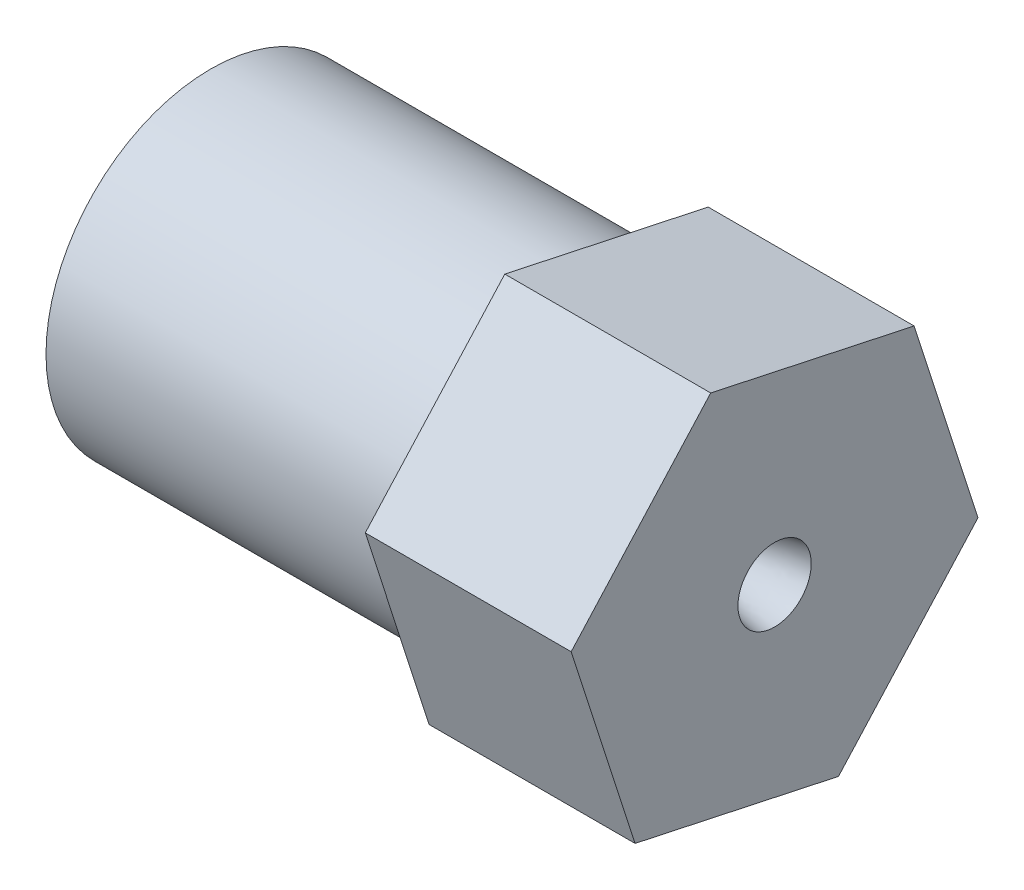
ISO-10303-21;
HEADER;
FILE_DESCRIPTION(('STEP AP214'),'2;1');
FILE_NAME('part.step','',(''),(''),'','','');
FILE_SCHEMA(('AUTOMOTIVE_DESIGN { 1 0 10303 214 1 1 1 1 }'));
ENDSEC;
DATA;
#1=APPLICATION_CONTEXT('core data for automotive mechanical design processes');
#2=APPLICATION_PROTOCOL_DEFINITION('international standard','automotive_design',2000,#1);
#3=PRODUCT_CONTEXT('',#1,'mechanical');
#4=PRODUCT('Part','Part','',(#3));
#5=PRODUCT_RELATED_PRODUCT_CATEGORY('part','',(#4));
#6=PRODUCT_DEFINITION_FORMATION('','',#4);
#7=PRODUCT_DEFINITION_CONTEXT('part definition',#1,'design');
#8=PRODUCT_DEFINITION('design','',#6,#7);
#9=PRODUCT_DEFINITION_SHAPE('','',#8);
#10=(LENGTH_UNIT() NAMED_UNIT(*) SI_UNIT(.MILLI.,.METRE.));
#11=(NAMED_UNIT(*) PLANE_ANGLE_UNIT() SI_UNIT($,.RADIAN.));
#12=(NAMED_UNIT(*) SI_UNIT($,.STERADIAN.) SOLID_ANGLE_UNIT());
#13=UNCERTAINTY_MEASURE_WITH_UNIT(LENGTH_MEASURE(1.E-05),#10,'distance_accuracy_value','');
#14=(GEOMETRIC_REPRESENTATION_CONTEXT(3) GLOBAL_UNCERTAINTY_ASSIGNED_CONTEXT((#13)) GLOBAL_UNIT_ASSIGNED_CONTEXT((#10,
#11,#12)) REPRESENTATION_CONTEXT('',''));
#15=CARTESIAN_POINT('',(0.,0.,0.));
#16=DIRECTION('',(0.,0.,1.));
#17=DIRECTION('',(1.,0.,0.));
#18=AXIS2_PLACEMENT_3D('',#15,#16,#17);
#19=CARTESIAN_POINT('',(0.,0.,0.));
#20=DIRECTION('',(-1.,0.,0.));
#21=DIRECTION('',(0.,0.,1.));
#22=AXIS2_PLACEMENT_3D('',#19,#20,#21);
#23=CYLINDRICAL_SURFACE('',#22,10.16);
#24=CARTESIAN_POINT('',(-10.3062396168287,0.,0.));
#25=DIRECTION('',(1.,0.,0.));
#26=DIRECTION('',(0.,0.,-1.));
#27=AXIS2_PLACEMENT_3D('',#24,#25,#26);
#28=CIRCLE('',#27,10.16);
#29=CARTESIAN_POINT('',(-10.3062396168287,0.,-10.16));
#30=VERTEX_POINT('',#29);
#31=EDGE_CURVE('E11',#30,#30,#28,.F.);
#32=ORIENTED_EDGE('',*,*,#31,.T.);
#33=EDGE_LOOP('',(#32));
#34=FACE_BOUND('',#33,.T.);
#35=CARTESIAN_POINT('',(-31.75,0.,0.));
#36=DIRECTION('',(-1.,0.,0.));
#37=DIRECTION('',(0.,0.,1.));
#38=AXIS2_PLACEMENT_3D('',#35,#36,#37);
#39=CIRCLE('',#38,10.16);
#40=CARTESIAN_POINT('',(-31.75,0.,10.16));
#41=VERTEX_POINT('',#40);
#42=EDGE_CURVE('E225',#41,#41,#39,.T.);
#43=ORIENTED_EDGE('',*,*,#42,.F.);
#44=EDGE_LOOP('',(#43));
#45=FACE_BOUND('',#44,.T.);
#46=ADVANCED_FACE('F37',(#34,#45),#23,.T.);
#47=CARTESIAN_POINT('',(0.,0.,0.));
#48=DIRECTION('',(-1.,0.,0.));
#49=DIRECTION('',(0.,0.,1.));
#50=AXIS2_PLACEMENT_3D('',#47,#48,#49);
#51=TOROIDAL_SURFACE('',#50,3.81,2.286);
#52=CARTESIAN_POINT('',(0.,0.,0.));
#53=DIRECTION('',(-1.,0.,0.));
#54=DIRECTION('',(0.,0.,1.));
#55=AXIS2_PLACEMENT_3D('',#52,#53,#54);
#56=CIRCLE('',#55,1.52400000006543);
#57=CARTESIAN_POINT('',(0.,0.,1.52400000006543));
#58=VERTEX_POINT('',#57);
#59=EDGE_CURVE('E177',#58,#58,#56,.T.);
#60=ORIENTED_EDGE('',*,*,#59,.F.);
#61=EDGE_LOOP('',(#60));
#62=FACE_BOUND('',#61,.T.);
#63=CARTESIAN_POINT('',(-1.61644610179243,0.,0.));
#64=DIRECTION('',(-1.,0.,0.));
#65=DIRECTION('',(0.,0.,1.));
#66=AXIS2_PLACEMENT_3D('',#63,#64,#65);
#67=CIRCLE('',#66,2.19355389820753);
#68=CARTESIAN_POINT('',(-1.61644610179243,0.,2.19355389820753));
#69=VERTEX_POINT('',#68);
#70=EDGE_CURVE('E142',#69,#69,#67,.T.);
#71=ORIENTED_EDGE('',*,*,#70,.T.);
#72=EDGE_LOOP('',(#71));
#73=FACE_BOUND('',#72,.T.);
#74=ADVANCED_FACE('F166',(#62,#73),#51,.T.);
#75=CARTESIAN_POINT('',(0.,0.,0.));
#76=DIRECTION('',(-1.,0.,0.));
#77=DIRECTION('',(0.,0.,1.));
#78=AXIS2_PLACEMENT_3D('',#75,#76,#77);
#79=TOROIDAL_SURFACE('',#78,2.1336,0.609599999934568);
#80=CARTESIAN_POINT('',(0.208495480845228,0.,0.));
#81=DIRECTION('',(-1.,0.,0.));
#82=DIRECTION('',(0.,0.,1.));
#83=AXIS2_PLACEMENT_3D('',#80,#81,#82);
#84=CIRCLE('',#83,1.56076337913114);
#85=CARTESIAN_POINT('',(0.208495480845228,0.,1.56076337913114));
#86=VERTEX_POINT('',#85);
#87=EDGE_CURVE('E231',#86,#86,#84,.T.);
#88=ORIENTED_EDGE('',*,*,#87,.F.);
#89=EDGE_LOOP('',(#88));
#90=FACE_BOUND('',#89,.T.);
#91=ORIENTED_EDGE('',*,*,#59,.T.);
#92=EDGE_LOOP('',(#91));
#93=FACE_BOUND('',#92,.T.);
#94=ADVANCED_FACE('F162',(#90,#93),#79,.T.);
#95=CARTESIAN_POINT('',(337120.597891066,-941474.424608266,0.));
#96=CARTESIAN_POINT('',(-342019.934823071,939694.181551878,0.));
#97=CARTESIAN_POINT('',(346920.105736992,-937907.695441975,0.));
#98=B_SPLINE_CURVE_WITH_KNOTS('',2,(#95,#96,#97),.UNSPECIFIED.,.F.,.F.,(3,3),(0.,1.),.UNSPECIFIED.);
#99=CARTESIAN_POINT('',(0.,0.,0.));
#100=DIRECTION('',(-1.,0.,0.));
#101=AXIS1_PLACEMENT('',#99,#100);
#102=SURFACE_OF_REVOLUTION('',#98,#101);
#103=CARTESIAN_POINT('',(3.02876038317125,0.,0.));
#104=DIRECTION('',(-1.,0.,0.));
#105=DIRECTION('',(0.,0.,1.));
#106=AXIS2_PLACEMENT_3D('',#103,#104,#105);
#107=CIRCLE('',#106,2.26045729886676);
#108=CARTESIAN_POINT('',(3.02876038317125,0.,2.26045729886676));
#109=VERTEX_POINT('',#108);
#110=EDGE_CURVE('E228',#109,#109,#107,.T.);
#111=ORIENTED_EDGE('',*,*,#110,.F.);
#112=EDGE_LOOP('',(#111));
#113=FACE_BOUND('',#112,.T.);
#114=ORIENTED_EDGE('',*,*,#87,.T.);
#115=EDGE_LOOP('',(#114));
#116=FACE_BOUND('',#115,.T.);
#117=ADVANCED_FACE('F157',(#113,#116),#102,.T.);
#118=CARTESIAN_POINT('',(3.02876038317125,10.16,0.));
#119=DIRECTION('',(-1.,0.,0.));
#120=DIRECTION('',(0.,0.,1.));
#121=AXIS2_PLACEMENT_3D('',#118,#119,#120);
#122=PLANE('',#121);
#123=ORIENTED_EDGE('',*,*,#110,.T.);
#124=EDGE_LOOP('',(#123));
#125=FACE_BOUND('',#124,.T.);
#126=DIRECTION('',(0.,-0.951681663898051,-0.307086324345838));
#127=VECTOR('',#126,1.);
#128=CARTESIAN_POINT('',(3.02876038317125,-3.41249677929312,10.5755624900671));
#129=LINE('',#128,#127);
#130=CARTESIAN_POINT('',(3.02876038317125,2.69330707117882,12.5457684242007));
#131=VERTEX_POINT('',#130);
#132=CARTESIAN_POINT('',(3.02876038317125,-9.51830062976507,8.60535655593348));
#133=VERTEX_POINT('',#132);
#134=EDGE_CURVE('E125',#131,#133,#129,.T.);
#135=ORIENTED_EDGE('',*,*,#134,.T.);
#136=DIRECTION('',(0.,-0.209896273910742,-0.977723659424475));
#137=VECTOR('',#136,1.);
#138=CARTESIAN_POINT('',(3.02876038317125,-10.8649541653545,2.33247234383312));
#139=LINE('',#138,#137);
#140=CARTESIAN_POINT('',(3.02876038317125,-12.2116077009439,-3.94041186826723));
#141=VERTEX_POINT('',#140);
#142=EDGE_CURVE('E128',#133,#141,#139,.T.);
#143=ORIENTED_EDGE('',*,*,#142,.T.);
#144=DIRECTION('',(0.,0.741785389987309,-0.670637335078637));
#145=VECTOR('',#144,1.);
#146=CARTESIAN_POINT('',(3.02876038317125,-7.45245738606136,-8.24309014623397));
#147=LINE('',#146,#145);
#148=CARTESIAN_POINT('',(3.02876038317125,-2.69330707117882,-12.5457684242007));
#149=VERTEX_POINT('',#148);
#150=EDGE_CURVE('E131',#141,#149,#147,.T.);
#151=ORIENTED_EDGE('',*,*,#150,.T.);
#152=DIRECTION('',(0.,0.951681663898051,0.307086324345838));
#153=VECTOR('',#152,1.);
#154=CARTESIAN_POINT('',(3.02876038317125,3.41249677929312,-10.5755624900671));
#155=LINE('',#154,#153);
#156=CARTESIAN_POINT('',(3.02876038317125,9.51830062976506,-8.60535655593348));
#157=VERTEX_POINT('',#156);
#158=EDGE_CURVE('E134',#149,#157,#155,.T.);
#159=ORIENTED_EDGE('',*,*,#158,.T.);
#160=DIRECTION('',(0.,0.209896273910742,0.977723659424475));
#161=VECTOR('',#160,1.);
#162=CARTESIAN_POINT('',(3.02876038317125,10.8649541653545,-2.33247234383312));
#163=LINE('',#162,#161);
#164=CARTESIAN_POINT('',(3.02876038317125,12.2116077009439,3.94041186826724));
#165=VERTEX_POINT('',#164);
#166=EDGE_CURVE('E102',#157,#165,#163,.T.);
#167=ORIENTED_EDGE('',*,*,#166,.T.);
#168=DIRECTION('',(0.,-0.741785389987309,0.670637335078637));
#169=VECTOR('',#168,1.);
#170=CARTESIAN_POINT('',(3.02876038317125,7.45245738606136,8.24309014623397));
#171=LINE('',#170,#169);
#172=EDGE_CURVE('E137',#165,#131,#171,.T.);
#173=ORIENTED_EDGE('',*,*,#172,.T.);
#174=EDGE_LOOP('',(#135,#143,#151,#159,#167,#173));
#175=FACE_BOUND('',#174,.T.);
#176=ADVANCED_FACE('F161',(#125,#175),#122,.F.);
#177=CARTESIAN_POINT('',(-31.75,10.16,0.));
#178=DIRECTION('',(1.,0.,0.));
#179=DIRECTION('',(0.,0.,-1.));
#180=AXIS2_PLACEMENT_3D('',#177,#178,#179);
#181=PLANE('',#180);
#182=CARTESIAN_POINT('',(-31.75,0.,0.));
#183=DIRECTION('',(-1.,0.,0.));
#184=DIRECTION('',(0.,0.,1.));
#185=AXIS2_PLACEMENT_3D('',#182,#183,#184);
#186=CIRCLE('',#185,8.6614);
#187=CARTESIAN_POINT('',(-31.75,0.,8.6614));
#188=VERTEX_POINT('',#187);
#189=EDGE_CURVE('E222',#188,#188,#186,.T.);
#190=ORIENTED_EDGE('',*,*,#189,.F.);
#191=EDGE_LOOP('',(#190));
#192=FACE_BOUND('',#191,.T.);
#193=ORIENTED_EDGE('',*,*,#42,.T.);
#194=EDGE_LOOP('',(#193));
#195=FACE_BOUND('',#194,.T.);
#196=ADVANCED_FACE('F249',(#192,#195),#181,.F.);
#197=CARTESIAN_POINT('',(-31.115,0.,0.));
#198=DIRECTION('',(-1.,0.,0.));
#199=DIRECTION('',(0.,0.,1.));
#200=AXIS2_PLACEMENT_3D('',#197,#198,#199);
#201=TOROIDAL_SURFACE('',#200,8.6614,0.635);
#202=CARTESIAN_POINT('',(-31.115,0.,0.));
#203=DIRECTION('',(-1.,0.,0.));
#204=DIRECTION('',(0.,0.,1.));
#205=AXIS2_PLACEMENT_3D('',#202,#203,#204);
#206=CIRCLE('',#205,8.02639999999999);
#207=CARTESIAN_POINT('',(-31.115,0.,8.02639999999999));
#208=VERTEX_POINT('',#207);
#209=EDGE_CURVE('E219',#208,#208,#206,.T.);
#210=ORIENTED_EDGE('',*,*,#209,.F.);
#211=EDGE_LOOP('',(#210));
#212=FACE_BOUND('',#211,.T.);
#213=ORIENTED_EDGE('',*,*,#189,.T.);
#214=EDGE_LOOP('',(#213));
#215=FACE_BOUND('',#214,.T.);
#216=ADVANCED_FACE('F251',(#212,#215),#201,.T.);
#217=CARTESIAN_POINT('',(0.,0.,0.));
#218=DIRECTION('',(-1.,0.,0.));
#219=DIRECTION('',(0.,0.,1.));
#220=AXIS2_PLACEMENT_3D('',#217,#218,#219);
#221=CYLINDRICAL_SURFACE('',#220,8.02639999999999);
#222=CARTESIAN_POINT('',(-25.019,0.,0.));
#223=DIRECTION('',(-1.,0.,0.));
#224=DIRECTION('',(0.,0.,1.));
#225=AXIS2_PLACEMENT_3D('',#222,#223,#224);
#226=CIRCLE('',#225,8.02639999999999);
#227=CARTESIAN_POINT('',(-25.019,0.,8.02639999999999));
#228=VERTEX_POINT('',#227);
#229=EDGE_CURVE('E216',#228,#228,#226,.T.);
#230=ORIENTED_EDGE('',*,*,#229,.F.);
#231=EDGE_LOOP('',(#230));
#232=FACE_BOUND('',#231,.T.);
#233=ORIENTED_EDGE('',*,*,#209,.T.);
#234=EDGE_LOOP('',(#233));
#235=FACE_BOUND('',#234,.T.);
#236=ADVANCED_FACE('F258',(#232,#235),#221,.F.);
#237=CARTESIAN_POINT('',(-25.019,0.,0.));
#238=DIRECTION('',(-1.,0.,0.));
#239=DIRECTION('',(0.,0.,1.));
#240=AXIS2_PLACEMENT_3D('',#237,#238,#239);
#241=TOROIDAL_SURFACE('',#240,7.89939999999999,0.127);
#242=CARTESIAN_POINT('',(-24.892,0.,0.));
#243=DIRECTION('',(-1.,0.,0.));
#244=DIRECTION('',(0.,0.,1.));
#245=AXIS2_PLACEMENT_3D('',#242,#243,#244);
#246=CIRCLE('',#245,7.89939999999999);
#247=CARTESIAN_POINT('',(-24.892,0.,7.89939999999999));
#248=VERTEX_POINT('',#247);
#249=EDGE_CURVE('E213',#248,#248,#246,.T.);
#250=ORIENTED_EDGE('',*,*,#249,.F.);
#251=EDGE_LOOP('',(#250));
#252=FACE_BOUND('',#251,.T.);
#253=ORIENTED_EDGE('',*,*,#229,.T.);
#254=EDGE_LOOP('',(#253));
#255=FACE_BOUND('',#254,.T.);
#256=ADVANCED_FACE('F266',(#252,#255),#241,.F.);
#257=CARTESIAN_POINT('',(-24.892,6.9469,0.));
#258=DIRECTION('',(1.,0.,0.));
#259=DIRECTION('',(0.,0.,-1.));
#260=AXIS2_PLACEMENT_3D('',#257,#258,#259);
#261=PLANE('',#260);
#262=CARTESIAN_POINT('',(-24.892,0.,0.));
#263=DIRECTION('',(-1.,0.,0.));
#264=DIRECTION('',(0.,0.,1.));
#265=AXIS2_PLACEMENT_3D('',#262,#263,#264);
#266=CIRCLE('',#265,6.9469);
#267=CARTESIAN_POINT('',(-24.892,0.,6.9469));
#268=VERTEX_POINT('',#267);
#269=EDGE_CURVE('E210',#268,#268,#266,.T.);
#270=ORIENTED_EDGE('',*,*,#269,.F.);
#271=EDGE_LOOP('',(#270));
#272=FACE_BOUND('',#271,.T.);
#273=ORIENTED_EDGE('',*,*,#249,.T.);
#274=EDGE_LOOP('',(#273));
#275=FACE_BOUND('',#274,.T.);
#276=ADVANCED_FACE('F270',(#272,#275),#261,.F.);
#277=CARTESIAN_POINT('',(0.,0.,0.));
#278=DIRECTION('',(-1.,0.,0.));
#279=DIRECTION('',(0.,0.,1.));
#280=AXIS2_PLACEMENT_3D('',#277,#278,#279);
#281=CYLINDRICAL_SURFACE('',#280,6.9469);
#282=CARTESIAN_POINT('',(-20.066,0.,0.));
#283=DIRECTION('',(-1.,0.,0.));
#284=DIRECTION('',(0.,0.,1.));
#285=AXIS2_PLACEMENT_3D('',#282,#283,#284);
#286=CIRCLE('',#285,6.9469);
#287=CARTESIAN_POINT('',(-20.066,0.,6.9469));
#288=VERTEX_POINT('',#287);
#289=EDGE_CURVE('E207',#288,#288,#286,.T.);
#290=ORIENTED_EDGE('',*,*,#289,.F.);
#291=EDGE_LOOP('',(#290));
#292=FACE_BOUND('',#291,.T.);
#293=ORIENTED_EDGE('',*,*,#269,.T.);
#294=EDGE_LOOP('',(#293));
#295=FACE_BOUND('',#294,.T.);
#296=ADVANCED_FACE('F274',(#292,#295),#281,.F.);
#297=CARTESIAN_POINT('',(-20.066,0.,0.));
#298=DIRECTION('',(-1.,0.,0.));
#299=DIRECTION('',(0.,0.,1.));
#300=AXIS2_PLACEMENT_3D('',#297,#298,#299);
#301=TOROIDAL_SURFACE('',#300,6.8199,0.127);
#302=CARTESIAN_POINT('',(-19.939,0.,0.));
#303=DIRECTION('',(-1.,0.,0.));
#304=DIRECTION('',(0.,0.,1.));
#305=AXIS2_PLACEMENT_3D('',#302,#303,#304);
#306=CIRCLE('',#305,6.8199);
#307=CARTESIAN_POINT('',(-19.939,0.,6.8199));
#308=VERTEX_POINT('',#307);
#309=EDGE_CURVE('E204',#308,#308,#306,.T.);
#310=ORIENTED_EDGE('',*,*,#309,.F.);
#311=EDGE_LOOP('',(#310));
#312=FACE_BOUND('',#311,.T.);
#313=ORIENTED_EDGE('',*,*,#289,.T.);
#314=EDGE_LOOP('',(#313));
#315=FACE_BOUND('',#314,.T.);
#316=ADVANCED_FACE('F278',(#312,#315),#301,.F.);
#317=CARTESIAN_POINT('',(-19.939,5.46100000000001,0.));
#318=DIRECTION('',(1.,0.,0.));
#319=DIRECTION('',(0.,0.,-1.));
#320=AXIS2_PLACEMENT_3D('',#317,#318,#319);
#321=PLANE('',#320);
#322=CARTESIAN_POINT('',(-19.939,0.,0.));
#323=DIRECTION('',(-1.,0.,0.));
#324=DIRECTION('',(0.,0.,1.));
#325=AXIS2_PLACEMENT_3D('',#322,#323,#324);
#326=CIRCLE('',#325,5.46100000000001);
#327=CARTESIAN_POINT('',(-19.939,0.,5.46100000000001));
#328=VERTEX_POINT('',#327);
#329=EDGE_CURVE('E201',#328,#328,#326,.T.);
#330=ORIENTED_EDGE('',*,*,#329,.F.);
#331=EDGE_LOOP('',(#330));
#332=FACE_BOUND('',#331,.T.);
#333=ORIENTED_EDGE('',*,*,#309,.T.);
#334=EDGE_LOOP('',(#333));
#335=FACE_BOUND('',#334,.T.);
#336=ADVANCED_FACE('F282',(#332,#335),#321,.F.);
#337=CARTESIAN_POINT('',(-19.304,0.,0.));
#338=DIRECTION('',(-1.,0.,0.));
#339=DIRECTION('',(0.,0.,1.));
#340=AXIS2_PLACEMENT_3D('',#337,#338,#339);
#341=TOROIDAL_SURFACE('',#340,5.461,0.635);
#342=CARTESIAN_POINT('',(-19.304,0.,0.));
#343=DIRECTION('',(-1.,0.,0.));
#344=DIRECTION('',(0.,0.,1.));
#345=AXIS2_PLACEMENT_3D('',#342,#343,#344);
#346=CIRCLE('',#345,4.826);
#347=CARTESIAN_POINT('',(-19.304,0.,4.826));
#348=VERTEX_POINT('',#347);
#349=EDGE_CURVE('E198',#348,#348,#346,.T.);
#350=ORIENTED_EDGE('',*,*,#349,.F.);
#351=EDGE_LOOP('',(#350));
#352=FACE_BOUND('',#351,.T.);
#353=ORIENTED_EDGE('',*,*,#329,.T.);
#354=EDGE_LOOP('',(#353));
#355=FACE_BOUND('',#354,.T.);
#356=ADVANCED_FACE('F286',(#352,#355),#341,.T.);
#357=CARTESIAN_POINT('',(0.,0.,0.));
#358=DIRECTION('',(-1.,0.,0.));
#359=DIRECTION('',(0.,0.,1.));
#360=AXIS2_PLACEMENT_3D('',#357,#358,#359);
#361=CYLINDRICAL_SURFACE('',#360,4.826);
#362=CARTESIAN_POINT('',(-13.589,0.,0.));
#363=DIRECTION('',(-1.,0.,0.));
#364=DIRECTION('',(0.,0.,1.));
#365=AXIS2_PLACEMENT_3D('',#362,#363,#364);
#366=CIRCLE('',#365,4.826);
#367=CARTESIAN_POINT('',(-13.589,0.,4.826));
#368=VERTEX_POINT('',#367);
#369=EDGE_CURVE('E195',#368,#368,#366,.T.);
#370=ORIENTED_EDGE('',*,*,#369,.F.);
#371=EDGE_LOOP('',(#370));
#372=FACE_BOUND('',#371,.T.);
#373=ORIENTED_EDGE('',*,*,#349,.T.);
#374=EDGE_LOOP('',(#373));
#375=FACE_BOUND('',#374,.T.);
#376=ADVANCED_FACE('F290',(#372,#375),#361,.F.);
#377=CARTESIAN_POINT('',(-13.589,0.,0.));
#378=DIRECTION('',(-1.,0.,0.));
#379=DIRECTION('',(0.,0.,1.));
#380=AXIS2_PLACEMENT_3D('',#377,#378,#379);
#381=TOROIDAL_SURFACE('',#380,4.699,0.127);
#382=CARTESIAN_POINT('',(-13.462,0.,0.));
#383=DIRECTION('',(-1.,0.,0.));
#384=DIRECTION('',(0.,0.,1.));
#385=AXIS2_PLACEMENT_3D('',#382,#383,#384);
#386=CIRCLE('',#385,4.699);
#387=CARTESIAN_POINT('',(-13.462,0.,4.699));
#388=VERTEX_POINT('',#387);
#389=EDGE_CURVE('E192',#388,#388,#386,.T.);
#390=ORIENTED_EDGE('',*,*,#389,.F.);
#391=EDGE_LOOP('',(#390));
#392=FACE_BOUND('',#391,.T.);
#393=ORIENTED_EDGE('',*,*,#369,.T.);
#394=EDGE_LOOP('',(#393));
#395=FACE_BOUND('',#394,.T.);
#396=ADVANCED_FACE('F294',(#392,#395),#381,.F.);
#397=CARTESIAN_POINT('',(-13.462,4.445,0.));
#398=DIRECTION('',(1.,0.,0.));
#399=DIRECTION('',(0.,0.,-1.));
#400=AXIS2_PLACEMENT_3D('',#397,#398,#399);
#401=PLANE('',#400);
#402=CARTESIAN_POINT('',(-13.462,0.,0.));
#403=DIRECTION('',(-1.,0.,0.));
#404=DIRECTION('',(0.,0.,1.));
#405=AXIS2_PLACEMENT_3D('',#402,#403,#404);
#406=CIRCLE('',#405,4.445);
#407=CARTESIAN_POINT('',(-13.462,0.,4.445));
#408=VERTEX_POINT('',#407);
#409=EDGE_CURVE('E187',#408,#408,#406,.T.);
#410=ORIENTED_EDGE('',*,*,#409,.F.);
#411=EDGE_LOOP('',(#410));
#412=FACE_BOUND('',#411,.T.);
#413=ORIENTED_EDGE('',*,*,#389,.T.);
#414=EDGE_LOOP('',(#413));
#415=FACE_BOUND('',#414,.T.);
#416=ADVANCED_FACE('F298',(#412,#415),#401,.F.);
#417=CARTESIAN_POINT('',(0.,0.,0.));
#418=DIRECTION('',(-1.,0.,0.));
#419=DIRECTION('',(0.,0.,1.));
#420=AXIS2_PLACEMENT_3D('',#417,#418,#419);
#421=CYLINDRICAL_SURFACE('',#420,4.445);
#422=CARTESIAN_POINT('',(-5.1830202641195,0.,0.));
#423=DIRECTION('',(-1.,0.,0.));
#424=DIRECTION('',(0.,0.,1.));
#425=AXIS2_PLACEMENT_3D('',#422,#423,#424);
#426=CIRCLE('',#425,4.445);
#427=CARTESIAN_POINT('',(-5.1830202641195,0.,4.445));
#428=VERTEX_POINT('',#427);
#429=EDGE_CURVE('E183',#428,#428,#426,.T.);
#430=ORIENTED_EDGE('',*,*,#429,.F.);
#431=EDGE_LOOP('',(#430));
#432=FACE_BOUND('',#431,.T.);
#433=ORIENTED_EDGE('',*,*,#409,.T.);
#434=EDGE_LOOP('',(#433));
#435=FACE_BOUND('',#434,.T.);
#436=ADVANCED_FACE('F302',(#432,#435),#421,.F.);
#437=CARTESIAN_POINT('',(-5.1830202641195,0.,0.));
#438=DIRECTION('',(-1.,0.,0.));
#439=DIRECTION('',(0.,0.,1.));
#440=AXIS2_PLACEMENT_3D('',#437,#438,#439);
#441=DEGENERATE_TOROIDAL_SURFACE('',#440,1.27,3.175,.T.);
#442=CARTESIAN_POINT('',(-2.93795623385224,0.,0.));
#443=DIRECTION('',(-1.,0.,0.));
#444=DIRECTION('',(0.,0.,1.));
#445=AXIS2_PLACEMENT_3D('',#442,#443,#444);
#446=CIRCLE('',#445,3.51506403026731);
#447=CARTESIAN_POINT('',(-2.93795623385224,0.,3.51506403026731));
#448=VERTEX_POINT('',#447);
#449=EDGE_CURVE('E181',#448,#448,#446,.T.);
#450=ORIENTED_EDGE('',*,*,#449,.F.);
#451=EDGE_LOOP('',(#450));
#452=FACE_BOUND('',#451,.T.);
#453=ORIENTED_EDGE('',*,*,#429,.T.);
#454=EDGE_LOOP('',(#453));
#455=FACE_BOUND('',#454,.T.);
#456=ADVANCED_FACE('F306',(#452,#455),#441,.F.);
#457=CARTESIAN_POINT('',(-2.93795623385224,0.,0.));
#458=DIRECTION('',(-1.,0.,0.));
#459=DIRECTION('',(0.,0.,1.));
#460=AXIS2_PLACEMENT_3D('',#457,#458,#459);
#461=CONICAL_SURFACE('',#460,3.51506403026731,0.785398163397437);
#462=ORIENTED_EDGE('',*,*,#70,.F.);
#463=EDGE_LOOP('',(#462));
#464=FACE_BOUND('',#463,.T.);
#465=ORIENTED_EDGE('',*,*,#449,.T.);
#466=EDGE_LOOP('',(#465));
#467=FACE_BOUND('',#466,.T.);
#468=ADVANCED_FACE('F310',(#464,#467),#461,.F.);
#469=CARTESIAN_POINT('',(-9.67123961682875,-3.41249677929312,10.5755624900671));
#470=DIRECTION('',(0.,-0.307086324345838,0.951681663898051));
#471=DIRECTION('',(0.,-0.951681663898051,-0.307086324345838));
#472=AXIS2_PLACEMENT_3D('',#469,#470,#471);
#473=PLANE('',#472);
#474=ORIENTED_EDGE('',*,*,#134,.F.);
#475=DIRECTION('',(1.,0.,0.));
#476=VECTOR('',#475,1.);
#477=CARTESIAN_POINT('',(-9.67123961682875,2.69330707117882,12.5457684242007));
#478=LINE('',#477,#476);
#479=CARTESIAN_POINT('',(-9.67123961682875,2.69330707117882,12.5457684242007));
#480=VERTEX_POINT('',#479);
#481=EDGE_CURVE('E54',#480,#131,#478,.T.);
#482=ORIENTED_EDGE('',*,*,#481,.F.);
#483=DIRECTION('',(0.,-0.951681663898051,-0.307086324345838));
#484=VECTOR('',#483,1.);
#485=CARTESIAN_POINT('',(-9.67123961682875,-3.41249677929312,10.5755624900671));
#486=LINE('',#485,#484);
#487=CARTESIAN_POINT('',(-9.67123961682875,-9.51830062976507,8.60535655593348));
#488=VERTEX_POINT('',#487);
#489=EDGE_CURVE('E140',#480,#488,#486,.T.);
#490=ORIENTED_EDGE('',*,*,#489,.T.);
#491=DIRECTION('',(1.,0.,0.));
#492=VECTOR('',#491,1.);
#493=CARTESIAN_POINT('',(-9.67123961682875,-9.51830062976507,8.60535655593348));
#494=LINE('',#493,#492);
#495=EDGE_CURVE('E89',#488,#133,#494,.T.);
#496=ORIENTED_EDGE('',*,*,#495,.T.);
#497=EDGE_LOOP('',(#474,#482,#490,#496));
#498=FACE_BOUND('',#497,.T.);
#499=ADVANCED_FACE('F314',(#498),#473,.T.);
#500=CARTESIAN_POINT('',(-9.67123961682875,7.45245738606136,8.24309014623397));
#501=DIRECTION('',(0.,0.670637335078637,0.741785389987309));
#502=DIRECTION('',(0.,-0.741785389987309,0.670637335078637));
#503=AXIS2_PLACEMENT_3D('',#500,#501,#502);
#504=PLANE('',#503);
#505=ORIENTED_EDGE('',*,*,#172,.F.);
#506=DIRECTION('',(1.,0.,0.));
#507=VECTOR('',#506,1.);
#508=CARTESIAN_POINT('',(-9.67123961682875,12.2116077009439,3.94041186826724));
#509=LINE('',#508,#507);
#510=CARTESIAN_POINT('',(-9.67123961682875,12.2116077009439,3.94041186826724));
#511=VERTEX_POINT('',#510);
#512=EDGE_CURVE('E77',#511,#165,#509,.T.);
#513=ORIENTED_EDGE('',*,*,#512,.F.);
#514=DIRECTION('',(0.,-0.741785389987309,0.670637335078637));
#515=VECTOR('',#514,1.);
#516=CARTESIAN_POINT('',(-9.67123961682875,7.45245738606136,8.24309014623397));
#517=LINE('',#516,#515);
#518=EDGE_CURVE('E115',#511,#480,#517,.T.);
#519=ORIENTED_EDGE('',*,*,#518,.T.);
#520=ORIENTED_EDGE('',*,*,#481,.T.);
#521=EDGE_LOOP('',(#505,#513,#519,#520));
#522=FACE_BOUND('',#521,.T.);
#523=ADVANCED_FACE('F317',(#522),#504,.T.);
#524=CARTESIAN_POINT('',(-9.67123961682875,10.8649541653545,-2.33247234383312));
#525=DIRECTION('',(0.,0.977723659424475,-0.209896273910742));
#526=DIRECTION('',(0.,0.209896273910742,0.977723659424475));
#527=AXIS2_PLACEMENT_3D('',#524,#525,#526);
#528=PLANE('',#527);
#529=ORIENTED_EDGE('',*,*,#166,.F.);
#530=DIRECTION('',(1.,0.,0.));
#531=VECTOR('',#530,1.);
#532=CARTESIAN_POINT('',(-9.67123961682875,9.51830062976506,-8.60535655593348));
#533=LINE('',#532,#531);
#534=CARTESIAN_POINT('',(-9.67123961682875,9.51830062976506,-8.60535655593348));
#535=VERTEX_POINT('',#534);
#536=EDGE_CURVE('E97',#535,#157,#533,.T.);
#537=ORIENTED_EDGE('',*,*,#536,.F.);
#538=DIRECTION('',(0.,0.209896273910742,0.977723659424475));
#539=VECTOR('',#538,1.);
#540=CARTESIAN_POINT('',(-9.67123961682875,10.8649541653545,-2.33247234383312));
#541=LINE('',#540,#539);
#542=EDGE_CURVE('E100',#535,#511,#541,.T.);
#543=ORIENTED_EDGE('',*,*,#542,.T.);
#544=ORIENTED_EDGE('',*,*,#512,.T.);
#545=EDGE_LOOP('',(#529,#537,#543,#544));
#546=FACE_BOUND('',#545,.T.);
#547=ADVANCED_FACE('F99',(#546),#528,.T.);
#548=CARTESIAN_POINT('',(-9.67123961682875,3.41249677929312,-10.5755624900671));
#549=DIRECTION('',(0.,0.307086324345838,-0.951681663898051));
#550=DIRECTION('',(0.,0.951681663898051,0.307086324345838));
#551=AXIS2_PLACEMENT_3D('',#548,#549,#550);
#552=PLANE('',#551);
#553=ORIENTED_EDGE('',*,*,#158,.F.);
#554=DIRECTION('',(1.,0.,0.));
#555=VECTOR('',#554,1.);
#556=CARTESIAN_POINT('',(-9.67123961682875,-2.69330707117882,-12.5457684242007));
#557=LINE('',#556,#555);
#558=CARTESIAN_POINT('',(-9.67123961682875,-2.69330707117882,-12.5457684242007));
#559=VERTEX_POINT('',#558);
#560=EDGE_CURVE('E107',#559,#149,#557,.T.);
#561=ORIENTED_EDGE('',*,*,#560,.F.);
#562=DIRECTION('',(0.,0.951681663898051,0.307086324345838));
#563=VECTOR('',#562,1.);
#564=CARTESIAN_POINT('',(-9.67123961682875,3.41249677929312,-10.5755624900671));
#565=LINE('',#564,#563);
#566=EDGE_CURVE('E113',#559,#535,#565,.T.);
#567=ORIENTED_EDGE('',*,*,#566,.T.);
#568=ORIENTED_EDGE('',*,*,#536,.T.);
#569=EDGE_LOOP('',(#553,#561,#567,#568));
#570=FACE_BOUND('',#569,.T.);
#571=ADVANCED_FACE('F117',(#570),#552,.T.);
#572=CARTESIAN_POINT('',(-9.67123961682875,-7.45245738606136,-8.24309014623397));
#573=DIRECTION('',(0.,-0.670637335078637,-0.741785389987309));
#574=DIRECTION('',(0.,0.741785389987309,-0.670637335078637));
#575=AXIS2_PLACEMENT_3D('',#572,#573,#574);
#576=PLANE('',#575);
#577=ORIENTED_EDGE('',*,*,#150,.F.);
#578=DIRECTION('',(1.,0.,0.));
#579=VECTOR('',#578,1.);
#580=CARTESIAN_POINT('',(-9.67123961682875,-12.2116077009439,-3.94041186826723));
#581=LINE('',#580,#579);
#582=CARTESIAN_POINT('',(-9.67123961682875,-12.2116077009439,-3.94041186826723));
#583=VERTEX_POINT('',#582);
#584=EDGE_CURVE('E145',#583,#141,#581,.T.);
#585=ORIENTED_EDGE('',*,*,#584,.F.);
#586=DIRECTION('',(0.,0.741785389987309,-0.670637335078637));
#587=VECTOR('',#586,1.);
#588=CARTESIAN_POINT('',(-9.67123961682875,-7.45245738606136,-8.24309014623397));
#589=LINE('',#588,#587);
#590=EDGE_CURVE('E118',#583,#559,#589,.T.);
#591=ORIENTED_EDGE('',*,*,#590,.T.);
#592=ORIENTED_EDGE('',*,*,#560,.T.);
#593=EDGE_LOOP('',(#577,#585,#591,#592));
#594=FACE_BOUND('',#593,.T.);
#595=ADVANCED_FACE('F320',(#594),#576,.T.);
#596=CARTESIAN_POINT('',(-9.67123961682875,-10.8649541653545,2.33247234383312));
#597=DIRECTION('',(0.,-0.977723659424475,0.209896273910742));
#598=DIRECTION('',(0.,-0.209896273910742,-0.977723659424475));
#599=AXIS2_PLACEMENT_3D('',#596,#597,#598);
#600=PLANE('',#599);
#601=ORIENTED_EDGE('',*,*,#142,.F.);
#602=ORIENTED_EDGE('',*,*,#495,.F.);
#603=DIRECTION('',(0.,-0.209896273910742,-0.977723659424475));
#604=VECTOR('',#603,1.);
#605=CARTESIAN_POINT('',(-9.67123961682875,-10.8649541653545,2.33247234383312));
#606=LINE('',#605,#604);
#607=EDGE_CURVE('E120',#488,#583,#606,.T.);
#608=ORIENTED_EDGE('',*,*,#607,.T.);
#609=ORIENTED_EDGE('',*,*,#584,.T.);
#610=EDGE_LOOP('',(#601,#602,#608,#609));
#611=FACE_BOUND('',#610,.T.);
#612=ADVANCED_FACE('F243',(#611),#600,.T.);
#613=CARTESIAN_POINT('',(-9.67123961682875,0.,0.));
#614=DIRECTION('',(1.,0.,0.));
#615=DIRECTION('',(0.,0.,-1.));
#616=AXIS2_PLACEMENT_3D('',#613,#614,#615);
#617=PLANE('',#616);
#618=CARTESIAN_POINT('',(-9.67123961682875,0.,0.));
#619=DIRECTION('',(1.,0.,0.));
#620=DIRECTION('',(0.,0.,-1.));
#621=AXIS2_PLACEMENT_3D('',#618,#619,#620);
#622=CIRCLE('',#621,10.795);
#623=CARTESIAN_POINT('',(-9.67123961682875,0.,-10.795));
#624=VERTEX_POINT('',#623);
#625=EDGE_CURVE('E46',#624,#624,#622,.T.);
#626=ORIENTED_EDGE('',*,*,#625,.T.);
#627=EDGE_LOOP('',(#626));
#628=FACE_BOUND('',#627,.T.);
#629=ORIENTED_EDGE('',*,*,#489,.F.);
#630=ORIENTED_EDGE('',*,*,#518,.F.);
#631=ORIENTED_EDGE('',*,*,#542,.F.);
#632=ORIENTED_EDGE('',*,*,#566,.F.);
#633=ORIENTED_EDGE('',*,*,#590,.F.);
#634=ORIENTED_EDGE('',*,*,#607,.F.);
#635=EDGE_LOOP('',(#629,#630,#631,#632,#633,#634));
#636=FACE_BOUND('',#635,.T.);
#637=ADVANCED_FACE('F111',(#628,#636),#617,.F.);
#638=CARTESIAN_POINT('',(-10.3062396168287,0.,0.));
#639=DIRECTION('',(1.,0.,0.));
#640=DIRECTION('',(0.,0.,-1.));
#641=AXIS2_PLACEMENT_3D('',#638,#639,#640);
#642=TOROIDAL_SURFACE('',#641,10.795,0.635);
#643=ORIENTED_EDGE('',*,*,#31,.F.);
#644=EDGE_LOOP('',(#643));
#645=FACE_BOUND('',#644,.T.);
#646=ORIENTED_EDGE('',*,*,#625,.F.);
#647=EDGE_LOOP('',(#646));
#648=FACE_BOUND('',#647,.T.);
#649=ADVANCED_FACE('F39',(#645,#648),#642,.F.);
#650=CLOSED_SHELL('',(#46,#74,#94,#117,#176,#196,#216,#236,#256,#276,#296,#316,#336,#356,#376,
#396,#416,#436,#456,#468,#499,#523,#547,#571,#595,#612,#637,#649));
#651=MANIFOLD_SOLID_BREP('B2',#650);
#652=ADVANCED_BREP_SHAPE_REPRESENTATION('',(#18,#651),#14);
#653=SHAPE_DEFINITION_REPRESENTATION(#9,#652);
ENDSEC;
END-ISO-10303-21;
